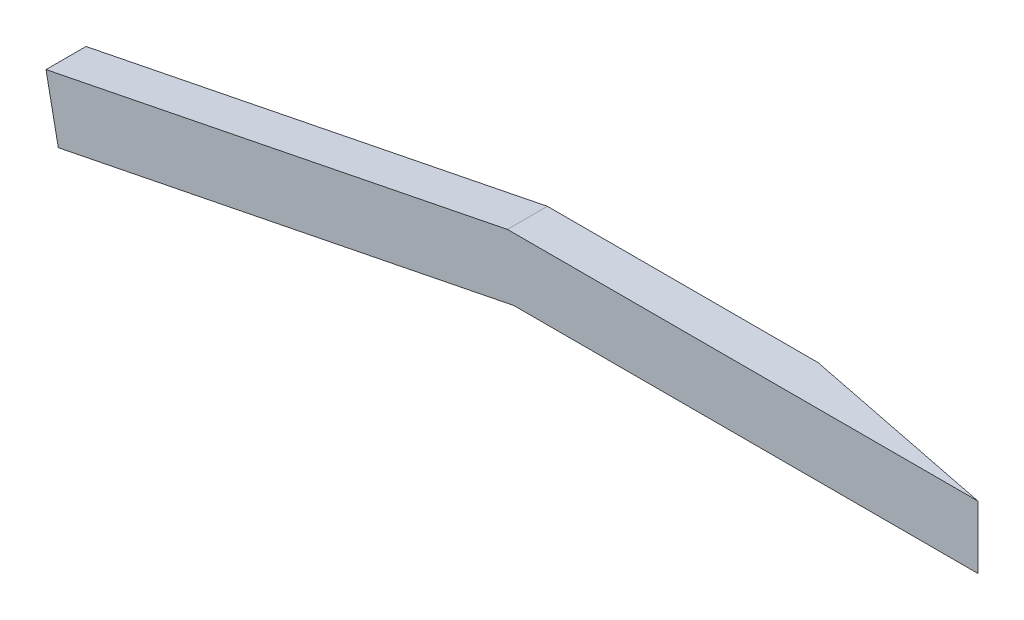
ISO-10303-21;
HEADER;
FILE_DESCRIPTION(('STEP AP214'),'2;1');
FILE_NAME('part.step','',(''),(''),'','','');
FILE_SCHEMA(('AUTOMOTIVE_DESIGN { 1 0 10303 214 1 1 1 1 }'));
ENDSEC;
DATA;
#1=APPLICATION_CONTEXT('core data for automotive mechanical design processes');
#2=APPLICATION_PROTOCOL_DEFINITION('international standard','automotive_design',2000,#1);
#3=PRODUCT_CONTEXT('',#1,'mechanical');
#4=PRODUCT('Part','Part','',(#3));
#5=PRODUCT_RELATED_PRODUCT_CATEGORY('part','',(#4));
#6=PRODUCT_DEFINITION_FORMATION('','',#4);
#7=PRODUCT_DEFINITION_CONTEXT('part definition',#1,'design');
#8=PRODUCT_DEFINITION('design','',#6,#7);
#9=PRODUCT_DEFINITION_SHAPE('','',#8);
#10=(LENGTH_UNIT() NAMED_UNIT(*) SI_UNIT(.MILLI.,.METRE.));
#11=(NAMED_UNIT(*) PLANE_ANGLE_UNIT() SI_UNIT($,.RADIAN.));
#12=(NAMED_UNIT(*) SI_UNIT($,.STERADIAN.) SOLID_ANGLE_UNIT());
#13=UNCERTAINTY_MEASURE_WITH_UNIT(LENGTH_MEASURE(1.E-05),#10,'distance_accuracy_value','');
#14=(GEOMETRIC_REPRESENTATION_CONTEXT(3) GLOBAL_UNCERTAINTY_ASSIGNED_CONTEXT((#13)) GLOBAL_UNIT_ASSIGNED_CONTEXT((#10,
#11,#12)) REPRESENTATION_CONTEXT('',''));
#15=CARTESIAN_POINT('',(0.,0.,0.));
#16=DIRECTION('',(0.,0.,1.));
#17=DIRECTION('',(1.,0.,0.));
#18=AXIS2_PLACEMENT_3D('',#15,#16,#17);
#19=CARTESIAN_POINT('',(-1.87871976637552,2.,0.122275657166917));
#20=DIRECTION('',(0.,0.,1.));
#21=DIRECTION('',(1.,0.,0.));
#22=AXIS2_PLACEMENT_3D('',#19,#20,#21);
#23=PLANE('',#22);
#24=DIRECTION('',(-0.980580675704679,-0.196116135069388,0.));
#25=VECTOR('',#24,1.);
#26=CARTESIAN_POINT('',(-1.87871976637552,2.,0.122275657166917));
#27=LINE('',#26,#25);
#28=CARTESIAN_POINT('',(-1.87871976637552,2.,0.122275657166917));
#29=VERTEX_POINT('',#28);
#30=CARTESIAN_POINT('',(-16.5874299019457,-0.941742026040824,0.122275657166917));
#31=VERTEX_POINT('',#30);
#32=EDGE_CURVE('E105',#29,#31,#27,.T.);
#33=ORIENTED_EDGE('',*,*,#32,.F.);
#34=DIRECTION('',(-1.,0.,0.));
#35=VECTOR('',#34,1.);
#36=CARTESIAN_POINT('',(-1.87871976637552,2.,0.122275657166917));
#37=LINE('',#36,#35);
#38=CARTESIAN_POINT('',(6.74750584154404,2.,0.122275657166917));
#39=VERTEX_POINT('',#38);
#40=EDGE_CURVE('E77',#39,#29,#37,.T.);
#41=ORIENTED_EDGE('',*,*,#40,.F.);
#42=DIRECTION('',(0.,-1.,0.));
#43=VECTOR('',#42,1.);
#44=CARTESIAN_POINT('',(6.74750584154404,2.,0.122275657166917));
#45=LINE('',#44,#43);
#46=CARTESIAN_POINT('',(6.74750584154404,0.,0.122275657166917));
#47=VERTEX_POINT('',#46);
#48=EDGE_CURVE('E71',#39,#47,#45,.T.);
#49=ORIENTED_EDGE('',*,*,#48,.T.);
#50=DIRECTION('',(-1.,0.,0.));
#51=VECTOR('',#50,1.);
#52=CARTESIAN_POINT('',(-1.87871976637552,0.,0.122275657166917));
#53=LINE('',#52,#51);
#54=CARTESIAN_POINT('',(-1.6806807392608,0.,0.122275657166917));
#55=VERTEX_POINT('',#54);
#56=EDGE_CURVE('E84',#47,#55,#53,.T.);
#57=ORIENTED_EDGE('',*,*,#56,.T.);
#58=DIRECTION('',(0.980580675704679,0.196116135069389,0.));
#59=VECTOR('',#58,1.);
#60=CARTESIAN_POINT('',(-16.1951976318069,-2.90290337745018,0.122275657166917));
#61=LINE('',#60,#59);
#62=CARTESIAN_POINT('',(-16.1951976318069,-2.90290337745018,0.122275657166917));
#63=VERTEX_POINT('',#62);
#64=EDGE_CURVE('E102',#63,#55,#61,.T.);
#65=ORIENTED_EDGE('',*,*,#64,.F.);
#66=DIRECTION('',(0.196116135069388,-0.98058067570468,0.));
#67=VECTOR('',#66,1.);
#68=CARTESIAN_POINT('',(-16.5874299019457,-0.941742026040824,0.122275657166917));
#69=LINE('',#68,#67);
#70=EDGE_CURVE('E113',#31,#63,#69,.T.);
#71=ORIENTED_EDGE('',*,*,#70,.F.);
#72=EDGE_LOOP('',(#33,#41,#49,#57,#65,#71));
#73=FACE_BOUND('',#72,.T.);
#74=ADVANCED_FACE('F33',(#73),#23,.F.);
#75=CARTESIAN_POINT('',(13.1212802336245,2.,1.39703053511784));
#76=DIRECTION('',(0.,0.,-1.));
#77=DIRECTION('',(-1.,0.,0.));
#78=AXIS2_PLACEMENT_3D('',#75,#76,#77);
#79=PLANE('',#78);
#80=DIRECTION('',(1.,0.,0.));
#81=VECTOR('',#80,1.);
#82=CARTESIAN_POINT('',(13.1212802336245,2.,1.39703053511784));
#83=LINE('',#82,#81);
#84=CARTESIAN_POINT('',(-1.87871976637552,2.,1.39703053511785));
#85=VERTEX_POINT('',#84);
#86=CARTESIAN_POINT('',(13.1212802336245,2.,1.39703053511784));
#87=VERTEX_POINT('',#86);
#88=EDGE_CURVE('E95',#85,#87,#83,.T.);
#89=ORIENTED_EDGE('',*,*,#88,.F.);
#90=DIRECTION('',(-0.980580675704679,-0.196116135069388,0.));
#91=VECTOR('',#90,1.);
#92=CARTESIAN_POINT('',(-1.87871976637552,2.,1.39703053511785));
#93=LINE('',#92,#91);
#94=CARTESIAN_POINT('',(-16.5874299019457,-0.941742026040824,1.39703053511785));
#95=VERTEX_POINT('',#94);
#96=EDGE_CURVE('E108',#85,#95,#93,.T.);
#97=ORIENTED_EDGE('',*,*,#96,.T.);
#98=DIRECTION('',(0.196116135069388,-0.98058067570468,0.));
#99=VECTOR('',#98,1.);
#100=CARTESIAN_POINT('',(-16.5874299019457,-0.941742026040824,1.39703053511785));
#101=LINE('',#100,#99);
#102=CARTESIAN_POINT('',(-16.1951976318069,-2.90290337745018,1.39703053511785));
#103=VERTEX_POINT('',#102);
#104=EDGE_CURVE('E106',#95,#103,#101,.T.);
#105=ORIENTED_EDGE('',*,*,#104,.T.);
#106=DIRECTION('',(0.980580675704679,0.196116135069389,0.));
#107=VECTOR('',#106,1.);
#108=CARTESIAN_POINT('',(-16.1951976318069,-2.90290337745018,1.39703053511785));
#109=LINE('',#108,#107);
#110=CARTESIAN_POINT('',(-1.6806807392608,0.,1.39703053511785));
#111=VERTEX_POINT('',#110);
#112=EDGE_CURVE('E47',#103,#111,#109,.T.);
#113=ORIENTED_EDGE('',*,*,#112,.T.);
#114=DIRECTION('',(1.,0.,0.));
#115=VECTOR('',#114,1.);
#116=CARTESIAN_POINT('',(13.1212802336245,0.,1.39703053511784));
#117=LINE('',#116,#115);
#118=CARTESIAN_POINT('',(13.1212802336245,0.,1.39703053511784));
#119=VERTEX_POINT('',#118);
#120=EDGE_CURVE('E78',#111,#119,#117,.T.);
#121=ORIENTED_EDGE('',*,*,#120,.T.);
#122=DIRECTION('',(0.,-1.,0.));
#123=VECTOR('',#122,1.);
#124=CARTESIAN_POINT('',(13.1212802336245,2.,1.39703053511784));
#125=LINE('',#124,#123);
#126=EDGE_CURVE('E40',#87,#119,#125,.T.);
#127=ORIENTED_EDGE('',*,*,#126,.F.);
#128=EDGE_LOOP('',(#89,#97,#105,#113,#121,#127));
#129=FACE_BOUND('',#128,.T.);
#130=ADVANCED_FACE('F135',(#129),#79,.F.);
#131=CARTESIAN_POINT('',(6.74750584154404,2.,0.122275657166917));
#132=DIRECTION('',(-0.196116135069374,0.,0.980580675704682));
#133=DIRECTION('',(0.980580675704682,0.,0.196116135069374));
#134=AXIS2_PLACEMENT_3D('',#131,#132,#133);
#135=PLANE('',#134);
#136=DIRECTION('',(-0.980580675704682,0.,-0.196116135069374));
#137=VECTOR('',#136,1.);
#138=CARTESIAN_POINT('',(6.74750584154404,0.,0.122275657166917));
#139=LINE('',#138,#137);
#140=EDGE_CURVE('E68',#119,#47,#139,.T.);
#141=ORIENTED_EDGE('',*,*,#140,.T.);
#142=ORIENTED_EDGE('',*,*,#48,.F.);
#143=DIRECTION('',(-0.980580675704682,0.,-0.196116135069374));
#144=VECTOR('',#143,1.);
#145=CARTESIAN_POINT('',(6.74750584154404,2.,0.122275657166917));
#146=LINE('',#145,#144);
#147=EDGE_CURVE('E56',#87,#39,#146,.T.);
#148=ORIENTED_EDGE('',*,*,#147,.F.);
#149=ORIENTED_EDGE('',*,*,#126,.T.);
#150=EDGE_LOOP('',(#141,#142,#148,#149));
#151=FACE_BOUND('',#150,.T.);
#152=ADVANCED_FACE('F70',(#151),#135,.F.);
#153=CARTESIAN_POINT('',(0.,2.,0.));
#154=DIRECTION('',(0.,1.,0.));
#155=DIRECTION('',(0.,0.,1.));
#156=AXIS2_PLACEMENT_3D('',#153,#154,#155);
#157=PLANE('',#156);
#158=ORIENTED_EDGE('',*,*,#40,.T.);
#159=DIRECTION('',(0.,0.,1.));
#160=VECTOR('',#159,1.);
#161=CARTESIAN_POINT('',(-1.87871976637552,2.,1.39703053511785));
#162=LINE('',#161,#160);
#163=EDGE_CURVE('E97',#29,#85,#162,.T.);
#164=ORIENTED_EDGE('',*,*,#163,.T.);
#165=ORIENTED_EDGE('',*,*,#88,.T.);
#166=ORIENTED_EDGE('',*,*,#147,.T.);
#167=EDGE_LOOP('',(#158,#164,#165,#166));
#168=FACE_BOUND('',#167,.T.);
#169=ADVANCED_FACE('F131',(#168),#157,.T.);
#170=CARTESIAN_POINT('',(0.,0.,0.));
#171=DIRECTION('',(0.,1.,0.));
#172=DIRECTION('',(0.,0.,1.));
#173=AXIS2_PLACEMENT_3D('',#170,#171,#172);
#174=PLANE('',#173);
#175=ORIENTED_EDGE('',*,*,#120,.F.);
#176=DIRECTION('',(0.,0.,-1.));
#177=VECTOR('',#176,1.);
#178=CARTESIAN_POINT('',(-1.68068073926083,0.,0.));
#179=LINE('',#178,#177);
#180=EDGE_CURVE('E11',#111,#55,#179,.T.);
#181=ORIENTED_EDGE('',*,*,#180,.T.);
#182=ORIENTED_EDGE('',*,*,#56,.F.);
#183=ORIENTED_EDGE('',*,*,#140,.F.);
#184=EDGE_LOOP('',(#175,#181,#182,#183));
#185=FACE_BOUND('',#184,.T.);
#186=ADVANCED_FACE('F86',(#185),#174,.F.);
#187=CARTESIAN_POINT('',(-16.1951976318069,-2.90290337745018,0.122275657166917));
#188=DIRECTION('',(0.196116135069389,-0.980580675704679,0.));
#189=DIRECTION('',(0.980580675704679,0.196116135069389,0.));
#190=AXIS2_PLACEMENT_3D('',#187,#188,#189);
#191=PLANE('',#190);
#192=ORIENTED_EDGE('',*,*,#180,.F.);
#193=ORIENTED_EDGE('',*,*,#112,.F.);
#194=DIRECTION('',(0.,0.,1.));
#195=VECTOR('',#194,1.);
#196=CARTESIAN_POINT('',(-16.1951976318069,-2.90290337745018,0.122275657166917));
#197=LINE('',#196,#195);
#198=EDGE_CURVE('E87',#63,#103,#197,.T.);
#199=ORIENTED_EDGE('',*,*,#198,.F.);
#200=ORIENTED_EDGE('',*,*,#64,.T.);
#201=EDGE_LOOP('',(#192,#193,#199,#200));
#202=FACE_BOUND('',#201,.T.);
#203=ADVANCED_FACE('F141',(#202),#191,.T.);
#204=CARTESIAN_POINT('',(-16.5874299019457,-0.941742026040824,0.122275657166917));
#205=DIRECTION('',(-0.980580675704679,-0.196116135069388,0.));
#206=DIRECTION('',(0.196116135069388,-0.980580675704679,0.));
#207=AXIS2_PLACEMENT_3D('',#204,#205,#206);
#208=PLANE('',#207);
#209=ORIENTED_EDGE('',*,*,#104,.F.);
#210=DIRECTION('',(0.,0.,1.));
#211=VECTOR('',#210,1.);
#212=CARTESIAN_POINT('',(-16.5874299019457,-0.941742026040824,0.122275657166917));
#213=LINE('',#212,#211);
#214=EDGE_CURVE('E91',#31,#95,#213,.T.);
#215=ORIENTED_EDGE('',*,*,#214,.F.);
#216=ORIENTED_EDGE('',*,*,#70,.T.);
#217=ORIENTED_EDGE('',*,*,#198,.T.);
#218=EDGE_LOOP('',(#209,#215,#216,#217));
#219=FACE_BOUND('',#218,.T.);
#220=ADVANCED_FACE('F143',(#219),#208,.T.);
#221=CARTESIAN_POINT('',(-1.87871976637552,2.,0.122275657166917));
#222=DIRECTION('',(-0.196116135069388,0.980580675704679,0.));
#223=DIRECTION('',(-0.980580675704679,-0.196116135069388,0.));
#224=AXIS2_PLACEMENT_3D('',#221,#222,#223);
#225=PLANE('',#224);
#226=ORIENTED_EDGE('',*,*,#96,.F.);
#227=ORIENTED_EDGE('',*,*,#163,.F.);
#228=ORIENTED_EDGE('',*,*,#32,.T.);
#229=ORIENTED_EDGE('',*,*,#214,.T.);
#230=EDGE_LOOP('',(#226,#227,#228,#229));
#231=FACE_BOUND('',#230,.T.);
#232=ADVANCED_FACE('F121',(#231),#225,.T.);
#233=CLOSED_SHELL('',(#74,#130,#152,#169,#186,#203,#220,#232));
#234=MANIFOLD_SOLID_BREP('B2',#233);
#235=ADVANCED_BREP_SHAPE_REPRESENTATION('',(#18,#234),#14);
#236=SHAPE_DEFINITION_REPRESENTATION(#9,#235);
ENDSEC;
END-ISO-10303-21;
